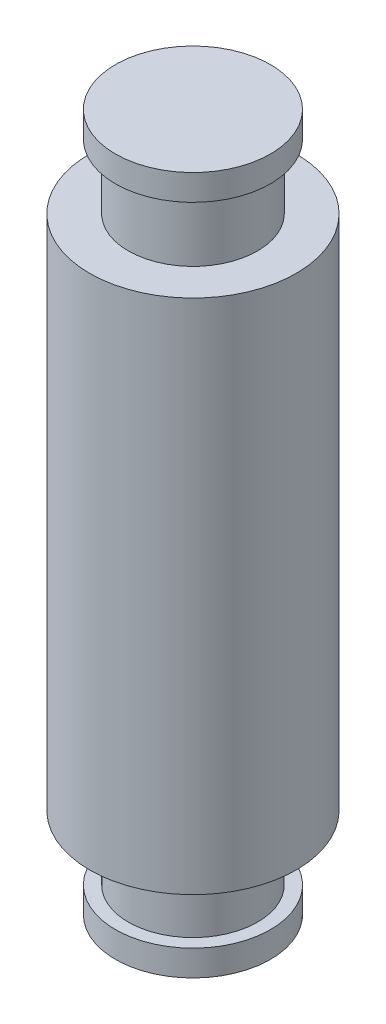
ISO-10303-21;
HEADER;
FILE_DESCRIPTION(('STEP AP214'),'2;1');
FILE_NAME('part.step','',(''),(''),'','','');
FILE_SCHEMA(('AUTOMOTIVE_DESIGN { 1 0 10303 214 1 1 1 1 }'));
ENDSEC;
DATA;
#1=APPLICATION_CONTEXT('core data for automotive mechanical design processes');
#2=APPLICATION_PROTOCOL_DEFINITION('international standard','automotive_design',2000,#1);
#3=PRODUCT_CONTEXT('',#1,'mechanical');
#4=PRODUCT('Part','Part','',(#3));
#5=PRODUCT_RELATED_PRODUCT_CATEGORY('part','',(#4));
#6=PRODUCT_DEFINITION_FORMATION('','',#4);
#7=PRODUCT_DEFINITION_CONTEXT('part definition',#1,'design');
#8=PRODUCT_DEFINITION('design','',#6,#7);
#9=PRODUCT_DEFINITION_SHAPE('','',#8);
#10=(LENGTH_UNIT() NAMED_UNIT(*) SI_UNIT(.MILLI.,.METRE.));
#11=(NAMED_UNIT(*) PLANE_ANGLE_UNIT() SI_UNIT($,.RADIAN.));
#12=(NAMED_UNIT(*) SI_UNIT($,.STERADIAN.) SOLID_ANGLE_UNIT());
#13=UNCERTAINTY_MEASURE_WITH_UNIT(LENGTH_MEASURE(1.E-05),#10,'distance_accuracy_value','');
#14=(GEOMETRIC_REPRESENTATION_CONTEXT(3) GLOBAL_UNCERTAINTY_ASSIGNED_CONTEXT((#13)) GLOBAL_UNIT_ASSIGNED_CONTEXT((#10,
#11,#12)) REPRESENTATION_CONTEXT('',''));
#15=CARTESIAN_POINT('',(0.,0.,0.));
#16=DIRECTION('',(0.,0.,1.));
#17=DIRECTION('',(1.,0.,0.));
#18=AXIS2_PLACEMENT_3D('',#15,#16,#17);
#19=CARTESIAN_POINT('',(0.,20.,0.));
#20=DIRECTION('',(0.,-1.,0.));
#21=DIRECTION('',(0.,0.,-1.));
#22=AXIS2_PLACEMENT_3D('',#19,#20,#21);
#23=CYLINDRICAL_SURFACE('',#22,4.);
#24=CARTESIAN_POINT('',(0.,20.,0.));
#25=DIRECTION('',(0.,1.,0.));
#26=DIRECTION('',(0.,0.,1.));
#27=AXIS2_PLACEMENT_3D('',#24,#25,#26);
#28=CIRCLE('',#27,4.);
#29=CARTESIAN_POINT('',(0.,20.,4.));
#30=VERTEX_POINT('',#29);
#31=EDGE_CURVE('E49',#30,#30,#28,.T.);
#32=ORIENTED_EDGE('',*,*,#31,.F.);
#33=EDGE_LOOP('',(#32));
#34=FACE_BOUND('',#33,.T.);
#35=CARTESIAN_POINT('',(0.,0.,0.));
#36=DIRECTION('',(0.,1.,0.));
#37=DIRECTION('',(0.,0.,1.));
#38=AXIS2_PLACEMENT_3D('',#35,#36,#37);
#39=CIRCLE('',#38,4.);
#40=CARTESIAN_POINT('',(0.,0.,4.));
#41=VERTEX_POINT('',#40);
#42=EDGE_CURVE('E40',#41,#41,#39,.T.);
#43=ORIENTED_EDGE('',*,*,#42,.T.);
#44=EDGE_LOOP('',(#43));
#45=FACE_BOUND('',#44,.T.);
#46=ADVANCED_FACE('F37',(#34,#45),#23,.T.);
#47=CARTESIAN_POINT('',(0.,20.,0.));
#48=DIRECTION('',(0.,1.,0.));
#49=DIRECTION('',(0.,0.,1.));
#50=AXIS2_PLACEMENT_3D('',#47,#48,#49);
#51=PLANE('',#50);
#52=CARTESIAN_POINT('',(0.,20.,0.));
#53=DIRECTION('',(0.,1.,0.));
#54=DIRECTION('',(0.,0.,1.));
#55=AXIS2_PLACEMENT_3D('',#52,#53,#54);
#56=CIRCLE('',#55,2.5);
#57=CARTESIAN_POINT('',(0.,20.,2.5));
#58=VERTEX_POINT('',#57);
#59=EDGE_CURVE('E10',#58,#58,#56,.T.);
#60=ORIENTED_EDGE('',*,*,#59,.F.);
#61=EDGE_LOOP('',(#60));
#62=FACE_BOUND('',#61,.T.);
#63=ORIENTED_EDGE('',*,*,#31,.T.);
#64=EDGE_LOOP('',(#63));
#65=FACE_BOUND('',#64,.T.);
#66=ADVANCED_FACE('F73',(#62,#65),#51,.T.);
#67=CARTESIAN_POINT('',(0.,0.,0.));
#68=DIRECTION('',(0.,1.,0.));
#69=DIRECTION('',(0.,0.,1.));
#70=AXIS2_PLACEMENT_3D('',#67,#68,#69);
#71=PLANE('',#70);
#72=CARTESIAN_POINT('',(0.,0.,0.));
#73=DIRECTION('',(0.,-1.,0.));
#74=DIRECTION('',(0.,0.,-1.));
#75=AXIS2_PLACEMENT_3D('',#72,#73,#74);
#76=CIRCLE('',#75,2.5);
#77=CARTESIAN_POINT('',(0.,0.,-2.5));
#78=VERTEX_POINT('',#77);
#79=EDGE_CURVE('E44',#78,#78,#76,.T.);
#80=ORIENTED_EDGE('',*,*,#79,.F.);
#81=EDGE_LOOP('',(#80));
#82=FACE_BOUND('',#81,.T.);
#83=ORIENTED_EDGE('',*,*,#42,.F.);
#84=EDGE_LOOP('',(#83));
#85=FACE_BOUND('',#84,.T.);
#86=ADVANCED_FACE('F70',(#82,#85),#71,.F.);
#87=CARTESIAN_POINT('',(0.,-2.5,0.));
#88=DIRECTION('',(0.,1.,0.));
#89=DIRECTION('',(0.,0.,1.));
#90=AXIS2_PLACEMENT_3D('',#87,#88,#89);
#91=CYLINDRICAL_SURFACE('',#90,2.5);
#92=CARTESIAN_POINT('',(0.,-2.5,0.));
#93=DIRECTION('',(0.,-1.,0.));
#94=DIRECTION('',(0.,0.,-1.));
#95=AXIS2_PLACEMENT_3D('',#92,#93,#94);
#96=CIRCLE('',#95,2.5);
#97=CARTESIAN_POINT('',(0.,-2.5,-2.5));
#98=VERTEX_POINT('',#97);
#99=EDGE_CURVE('E58',#98,#98,#96,.T.);
#100=ORIENTED_EDGE('',*,*,#99,.F.);
#101=EDGE_LOOP('',(#100));
#102=FACE_BOUND('',#101,.T.);
#103=ORIENTED_EDGE('',*,*,#79,.T.);
#104=EDGE_LOOP('',(#103));
#105=FACE_BOUND('',#104,.T.);
#106=ADVANCED_FACE('F72',(#102,#105),#91,.T.);
#107=CARTESIAN_POINT('',(0.,-3.5,0.));
#108=DIRECTION('',(0.,1.,0.));
#109=DIRECTION('',(0.,0.,1.));
#110=AXIS2_PLACEMENT_3D('',#107,#108,#109);
#111=CYLINDRICAL_SURFACE('',#110,3.);
#112=CARTESIAN_POINT('',(0.,-3.5,0.));
#113=DIRECTION('',(0.,-1.,0.));
#114=DIRECTION('',(0.,0.,-1.));
#115=AXIS2_PLACEMENT_3D('',#112,#113,#114);
#116=CIRCLE('',#115,3.);
#117=CARTESIAN_POINT('',(0.,-3.5,-3.));
#118=VERTEX_POINT('',#117);
#119=EDGE_CURVE('E55',#118,#118,#116,.T.);
#120=ORIENTED_EDGE('',*,*,#119,.F.);
#121=EDGE_LOOP('',(#120));
#122=FACE_BOUND('',#121,.T.);
#123=CARTESIAN_POINT('',(0.,-2.5,0.));
#124=DIRECTION('',(0.,-1.,0.));
#125=DIRECTION('',(0.,0.,-1.));
#126=AXIS2_PLACEMENT_3D('',#123,#124,#125);
#127=CIRCLE('',#126,3.);
#128=CARTESIAN_POINT('',(0.,-2.5,-3.));
#129=VERTEX_POINT('',#128);
#130=EDGE_CURVE('E59',#129,#129,#127,.T.);
#131=ORIENTED_EDGE('',*,*,#130,.T.);
#132=EDGE_LOOP('',(#131));
#133=FACE_BOUND('',#132,.T.);
#134=ADVANCED_FACE('F79',(#122,#133),#111,.T.);
#135=CARTESIAN_POINT('',(0.,-3.5,0.));
#136=DIRECTION('',(0.,-1.,0.));
#137=DIRECTION('',(0.,0.,-1.));
#138=AXIS2_PLACEMENT_3D('',#135,#136,#137);
#139=PLANE('',#138);
#140=ORIENTED_EDGE('',*,*,#119,.T.);
#141=EDGE_LOOP('',(#140));
#142=FACE_BOUND('',#141,.T.);
#143=ADVANCED_FACE('F147',(#142),#139,.T.);
#144=CARTESIAN_POINT('',(0.,-2.5,0.));
#145=DIRECTION('',(0.,-1.,0.));
#146=DIRECTION('',(0.,0.,-1.));
#147=AXIS2_PLACEMENT_3D('',#144,#145,#146);
#148=PLANE('',#147);
#149=ORIENTED_EDGE('',*,*,#99,.T.);
#150=EDGE_LOOP('',(#149));
#151=FACE_BOUND('',#150,.T.);
#152=ORIENTED_EDGE('',*,*,#130,.F.);
#153=EDGE_LOOP('',(#152));
#154=FACE_BOUND('',#153,.T.);
#155=ADVANCED_FACE('F100',(#151,#154),#148,.F.);
#156=CARTESIAN_POINT('',(0.,22.5,0.));
#157=DIRECTION('',(0.,-1.,0.));
#158=DIRECTION('',(0.,0.,-1.));
#159=AXIS2_PLACEMENT_3D('',#156,#157,#158);
#160=CYLINDRICAL_SURFACE('',#159,2.5);
#161=CARTESIAN_POINT('',(0.,22.5,0.));
#162=DIRECTION('',(0.,1.,0.));
#163=DIRECTION('',(0.,0.,1.));
#164=AXIS2_PLACEMENT_3D('',#161,#162,#163);
#165=CIRCLE('',#164,2.5);
#166=CARTESIAN_POINT('',(0.,22.5,2.5));
#167=VERTEX_POINT('',#166);
#168=EDGE_CURVE('E53',#167,#167,#165,.T.);
#169=ORIENTED_EDGE('',*,*,#168,.F.);
#170=EDGE_LOOP('',(#169));
#171=FACE_BOUND('',#170,.T.);
#172=ORIENTED_EDGE('',*,*,#59,.T.);
#173=EDGE_LOOP('',(#172));
#174=FACE_BOUND('',#173,.T.);
#175=ADVANCED_FACE('F105',(#171,#174),#160,.T.);
#176=CARTESIAN_POINT('',(0.,23.5,0.));
#177=DIRECTION('',(0.,-1.,0.));
#178=DIRECTION('',(0.,0.,-1.));
#179=AXIS2_PLACEMENT_3D('',#176,#177,#178);
#180=CYLINDRICAL_SURFACE('',#179,3.);
#181=CARTESIAN_POINT('',(0.,23.5,0.));
#182=DIRECTION('',(0.,1.,0.));
#183=DIRECTION('',(0.,0.,1.));
#184=AXIS2_PLACEMENT_3D('',#181,#182,#183);
#185=CIRCLE('',#184,3.);
#186=CARTESIAN_POINT('',(0.,23.5,3.));
#187=VERTEX_POINT('',#186);
#188=EDGE_CURVE('E189',#187,#187,#185,.T.);
#189=ORIENTED_EDGE('',*,*,#188,.F.);
#190=EDGE_LOOP('',(#189));
#191=FACE_BOUND('',#190,.T.);
#192=CARTESIAN_POINT('',(0.,22.5,0.));
#193=DIRECTION('',(0.,1.,0.));
#194=DIRECTION('',(0.,0.,1.));
#195=AXIS2_PLACEMENT_3D('',#192,#193,#194);
#196=CIRCLE('',#195,3.);
#197=CARTESIAN_POINT('',(0.,22.5,3.));
#198=VERTEX_POINT('',#197);
#199=EDGE_CURVE('E187',#198,#198,#196,.T.);
#200=ORIENTED_EDGE('',*,*,#199,.T.);
#201=EDGE_LOOP('',(#200));
#202=FACE_BOUND('',#201,.T.);
#203=ADVANCED_FACE('F110',(#191,#202),#180,.T.);
#204=CARTESIAN_POINT('',(0.,23.5,0.));
#205=DIRECTION('',(0.,1.,0.));
#206=DIRECTION('',(0.,0.,1.));
#207=AXIS2_PLACEMENT_3D('',#204,#205,#206);
#208=PLANE('',#207);
#209=ORIENTED_EDGE('',*,*,#188,.T.);
#210=EDGE_LOOP('',(#209));
#211=FACE_BOUND('',#210,.T.);
#212=ADVANCED_FACE('F120',(#211),#208,.T.);
#213=CARTESIAN_POINT('',(0.,22.5,0.));
#214=DIRECTION('',(0.,1.,0.));
#215=DIRECTION('',(0.,0.,1.));
#216=AXIS2_PLACEMENT_3D('',#213,#214,#215);
#217=PLANE('',#216);
#218=ORIENTED_EDGE('',*,*,#168,.T.);
#219=EDGE_LOOP('',(#218));
#220=FACE_BOUND('',#219,.T.);
#221=ORIENTED_EDGE('',*,*,#199,.F.);
#222=EDGE_LOOP('',(#221));
#223=FACE_BOUND('',#222,.T.);
#224=ADVANCED_FACE('F130',(#220,#223),#217,.F.);
#225=CLOSED_SHELL('',(#46,#66,#86,#106,#134,#143,#155,#175,#203,#212,#224));
#226=MANIFOLD_SOLID_BREP('B2',#225);
#227=ADVANCED_BREP_SHAPE_REPRESENTATION('',(#18,#226),#14);
#228=SHAPE_DEFINITION_REPRESENTATION(#9,#227);
ENDSEC;
END-ISO-10303-21;
